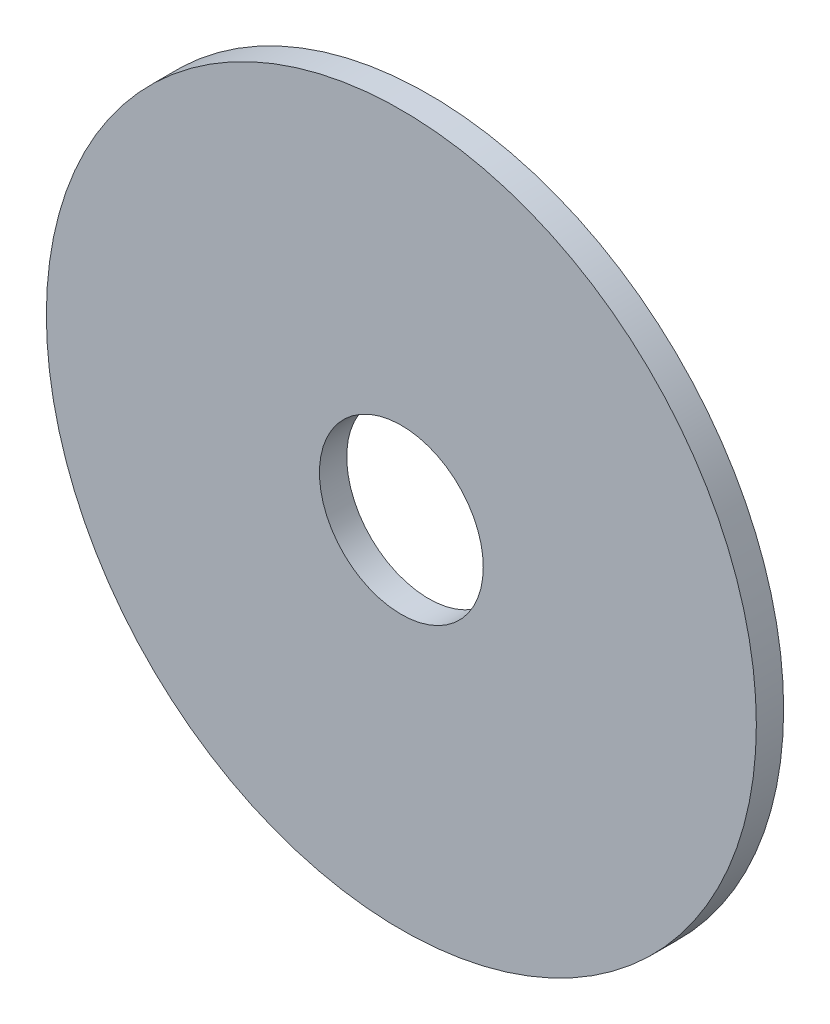
ISO-10303-21;
HEADER;
FILE_DESCRIPTION(('STEP AP214'),'2;1');
FILE_NAME('part.step','',(''),(''),'','','');
FILE_SCHEMA(('AUTOMOTIVE_DESIGN { 1 0 10303 214 1 1 1 1 }'));
ENDSEC;
DATA;
#1=APPLICATION_CONTEXT('core data for automotive mechanical design processes');
#2=APPLICATION_PROTOCOL_DEFINITION('international standard','automotive_design',2000,#1);
#3=PRODUCT_CONTEXT('',#1,'mechanical');
#4=PRODUCT('Part','Part','',(#3));
#5=PRODUCT_RELATED_PRODUCT_CATEGORY('part','',(#4));
#6=PRODUCT_DEFINITION_FORMATION('','',#4);
#7=PRODUCT_DEFINITION_CONTEXT('part definition',#1,'design');
#8=PRODUCT_DEFINITION('design','',#6,#7);
#9=PRODUCT_DEFINITION_SHAPE('','',#8);
#10=(LENGTH_UNIT() NAMED_UNIT(*) SI_UNIT(.MILLI.,.METRE.));
#11=(NAMED_UNIT(*) PLANE_ANGLE_UNIT() SI_UNIT($,.RADIAN.));
#12=(NAMED_UNIT(*) SI_UNIT($,.STERADIAN.) SOLID_ANGLE_UNIT());
#13=UNCERTAINTY_MEASURE_WITH_UNIT(LENGTH_MEASURE(1.E-05),#10,'distance_accuracy_value','');
#14=(GEOMETRIC_REPRESENTATION_CONTEXT(3) GLOBAL_UNCERTAINTY_ASSIGNED_CONTEXT((#13)) GLOBAL_UNIT_ASSIGNED_CONTEXT((#10,
#11,#12)) REPRESENTATION_CONTEXT('',''));
#15=CARTESIAN_POINT('',(0.,0.,0.));
#16=DIRECTION('',(0.,0.,1.));
#17=DIRECTION('',(1.,0.,0.));
#18=AXIS2_PLACEMENT_3D('',#15,#16,#17);
#19=CARTESIAN_POINT('',(0.,0.,1.));
#20=DIRECTION('',(0.,0.,-1.));
#21=DIRECTION('',(-1.,0.,0.));
#22=AXIS2_PLACEMENT_3D('',#19,#20,#21);
#23=CYLINDRICAL_SURFACE('',#22,13.);
#24=CARTESIAN_POINT('',(0.,0.,1.));
#25=DIRECTION('',(0.,0.,1.));
#26=DIRECTION('',(1.,0.,0.));
#27=AXIS2_PLACEMENT_3D('',#24,#25,#26);
#28=CIRCLE('',#27,13.);
#29=CARTESIAN_POINT('',(13.,0.,1.));
#30=VERTEX_POINT('',#29);
#31=EDGE_CURVE('E10',#30,#30,#28,.T.);
#32=ORIENTED_EDGE('',*,*,#31,.F.);
#33=EDGE_LOOP('',(#32));
#34=FACE_BOUND('',#33,.T.);
#35=CARTESIAN_POINT('',(0.,0.,0.));
#36=DIRECTION('',(0.,0.,1.));
#37=DIRECTION('',(1.,0.,0.));
#38=AXIS2_PLACEMENT_3D('',#35,#36,#37);
#39=CIRCLE('',#38,13.);
#40=CARTESIAN_POINT('',(13.,0.,0.));
#41=VERTEX_POINT('',#40);
#42=EDGE_CURVE('E35',#41,#41,#39,.T.);
#43=ORIENTED_EDGE('',*,*,#42,.T.);
#44=EDGE_LOOP('',(#43));
#45=FACE_BOUND('',#44,.T.);
#46=ADVANCED_FACE('F32',(#34,#45),#23,.T.);
#47=CARTESIAN_POINT('',(0.,0.,1.));
#48=DIRECTION('',(0.,0.,1.));
#49=DIRECTION('',(1.,0.,0.));
#50=AXIS2_PLACEMENT_3D('',#47,#48,#49);
#51=PLANE('',#50);
#52=CARTESIAN_POINT('',(0.,0.,1.));
#53=DIRECTION('',(0.,0.,1.));
#54=DIRECTION('',(1.,0.,0.));
#55=AXIS2_PLACEMENT_3D('',#52,#53,#54);
#56=CIRCLE('',#55,3.);
#57=CARTESIAN_POINT('',(3.,0.,1.));
#58=VERTEX_POINT('',#57);
#59=EDGE_CURVE('E44',#58,#58,#56,.T.);
#60=ORIENTED_EDGE('',*,*,#59,.F.);
#61=EDGE_LOOP('',(#60));
#62=FACE_BOUND('',#61,.T.);
#63=ORIENTED_EDGE('',*,*,#31,.T.);
#64=EDGE_LOOP('',(#63));
#65=FACE_BOUND('',#64,.T.);
#66=ADVANCED_FACE('F59',(#62,#65),#51,.T.);
#67=CARTESIAN_POINT('',(0.,0.,0.));
#68=DIRECTION('',(0.,0.,1.));
#69=DIRECTION('',(1.,0.,0.));
#70=AXIS2_PLACEMENT_3D('',#67,#68,#69);
#71=PLANE('',#70);
#72=CARTESIAN_POINT('',(0.,0.,0.));
#73=DIRECTION('',(0.,0.,1.));
#74=DIRECTION('',(1.,0.,0.));
#75=AXIS2_PLACEMENT_3D('',#72,#73,#74);
#76=CIRCLE('',#75,3.);
#77=CARTESIAN_POINT('',(3.,0.,0.));
#78=VERTEX_POINT('',#77);
#79=EDGE_CURVE('E42',#78,#78,#76,.T.);
#80=ORIENTED_EDGE('',*,*,#79,.T.);
#81=EDGE_LOOP('',(#80));
#82=FACE_BOUND('',#81,.T.);
#83=ORIENTED_EDGE('',*,*,#42,.F.);
#84=EDGE_LOOP('',(#83));
#85=FACE_BOUND('',#84,.T.);
#86=ADVANCED_FACE('F50',(#82,#85),#71,.F.);
#87=CARTESIAN_POINT('',(0.,0.,0.));
#88=DIRECTION('',(0.,0.,1.));
#89=DIRECTION('',(1.,0.,0.));
#90=AXIS2_PLACEMENT_3D('',#87,#88,#89);
#91=CYLINDRICAL_SURFACE('',#90,3.);
#92=ORIENTED_EDGE('',*,*,#79,.F.);
#93=EDGE_LOOP('',(#92));
#94=FACE_BOUND('',#93,.T.);
#95=ORIENTED_EDGE('',*,*,#59,.T.);
#96=EDGE_LOOP('',(#95));
#97=FACE_BOUND('',#96,.T.);
#98=ADVANCED_FACE('F53',(#94,#97),#91,.F.);
#99=CLOSED_SHELL('',(#46,#66,#86,#98));
#100=MANIFOLD_SOLID_BREP('B2',#99);
#101=ADVANCED_BREP_SHAPE_REPRESENTATION('',(#18,#100),#14);
#102=SHAPE_DEFINITION_REPRESENTATION(#9,#101);
ENDSEC;
END-ISO-10303-21;
